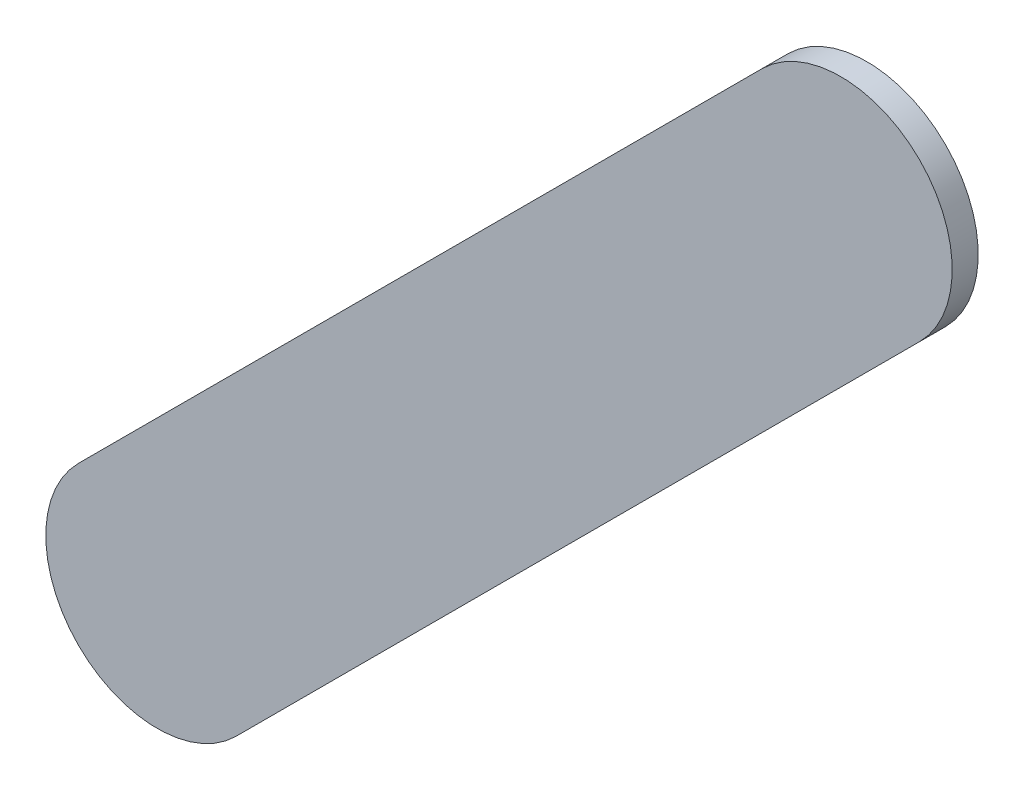
ISO-10303-21;
HEADER;
FILE_DESCRIPTION(('STEP AP214'),'2;1');
FILE_NAME('part.step','',(''),(''),'','','');
FILE_SCHEMA(('AUTOMOTIVE_DESIGN { 1 0 10303 214 1 1 1 1 }'));
ENDSEC;
DATA;
#1=APPLICATION_CONTEXT('core data for automotive mechanical design processes');
#2=APPLICATION_PROTOCOL_DEFINITION('international standard','automotive_design',2000,#1);
#3=PRODUCT_CONTEXT('',#1,'mechanical');
#4=PRODUCT('Part','Part','',(#3));
#5=PRODUCT_RELATED_PRODUCT_CATEGORY('part','',(#4));
#6=PRODUCT_DEFINITION_FORMATION('','',#4);
#7=PRODUCT_DEFINITION_CONTEXT('part definition',#1,'design');
#8=PRODUCT_DEFINITION('design','',#6,#7);
#9=PRODUCT_DEFINITION_SHAPE('','',#8);
#10=(LENGTH_UNIT() NAMED_UNIT(*) SI_UNIT(.MILLI.,.METRE.));
#11=(NAMED_UNIT(*) PLANE_ANGLE_UNIT() SI_UNIT($,.RADIAN.));
#12=(NAMED_UNIT(*) SI_UNIT($,.STERADIAN.) SOLID_ANGLE_UNIT());
#13=UNCERTAINTY_MEASURE_WITH_UNIT(LENGTH_MEASURE(1.E-05),#10,'distance_accuracy_value','');
#14=(GEOMETRIC_REPRESENTATION_CONTEXT(3) GLOBAL_UNCERTAINTY_ASSIGNED_CONTEXT((#13)) GLOBAL_UNIT_ASSIGNED_CONTEXT((#10,
#11,#12)) REPRESENTATION_CONTEXT('',''));
#15=CARTESIAN_POINT('',(0.,0.,0.));
#16=DIRECTION('',(0.,0.,1.));
#17=DIRECTION('',(1.,0.,0.));
#18=AXIS2_PLACEMENT_3D('',#15,#16,#17);
#19=CARTESIAN_POINT('',(126.106067,-60.436065,1.635));
#20=DIRECTION('',(0.,0.,1.));
#21=DIRECTION('',(1.,0.,0.));
#22=AXIS2_PLACEMENT_3D('',#19,#20,#21);
#23=PLANE('',#22);
#24=DIRECTION('',(0.707106781186548,0.707106781186548,0.));
#25=VECTOR('',#24,1.);
#26=CARTESIAN_POINT('',(126.106067,-60.436065,1.635));
#27=LINE('',#26,#25);
#28=CARTESIAN_POINT('',(126.106067,-60.436065,1.635));
#29=VERTEX_POINT('',#28);
#30=CARTESIAN_POINT('',(127.026066,-59.516066,1.635));
#31=VERTEX_POINT('',#30);
#32=EDGE_CURVE('E85',#29,#31,#27,.T.);
#33=ORIENTED_EDGE('',*,*,#32,.T.);
#34=CARTESIAN_POINT('',(126.9199995,-59.4099995,1.635));
#35=DIRECTION('',(0.,0.,1.));
#36=DIRECTION('',(0.707106781186548,-0.707106781186548,0.));
#37=AXIS2_PLACEMENT_3D('',#34,#35,#36);
#38=CIRCLE('',#37,0.150000682813);
#39=CARTESIAN_POINT('',(126.813933,-59.303933,1.635));
#40=VERTEX_POINT('',#39);
#41=EDGE_CURVE('E107',#31,#40,#38,.T.);
#42=ORIENTED_EDGE('',*,*,#41,.T.);
#43=DIRECTION('',(-0.707106781186548,-0.707106781186548,0.));
#44=VECTOR('',#43,1.);
#45=CARTESIAN_POINT('',(126.813933,-59.303933,1.635));
#46=LINE('',#45,#44);
#47=CARTESIAN_POINT('',(125.893934,-60.223932,1.635));
#48=VERTEX_POINT('',#47);
#49=EDGE_CURVE('E62',#40,#48,#46,.T.);
#50=ORIENTED_EDGE('',*,*,#49,.T.);
#51=CARTESIAN_POINT('',(126.0000005,-60.3299985,1.635));
#52=DIRECTION('',(0.,0.,1.));
#53=DIRECTION('',(-0.707106781186548,0.707106781186548,0.));
#54=AXIS2_PLACEMENT_3D('',#51,#52,#53);
#55=CIRCLE('',#54,0.150000682813);
#56=EDGE_CURVE('E11',#48,#29,#55,.T.);
#57=ORIENTED_EDGE('',*,*,#56,.T.);
#58=EDGE_LOOP('',(#33,#42,#50,#57));
#59=FACE_BOUND('',#58,.T.);
#60=ADVANCED_FACE('F17',(#59),#23,.T.);
#61=CARTESIAN_POINT('',(126.106067,-60.436065,1.6));
#62=DIRECTION('',(0.,0.,1.));
#63=DIRECTION('',(1.,0.,0.));
#64=AXIS2_PLACEMENT_3D('',#61,#62,#63);
#65=PLANE('',#64);
#66=CARTESIAN_POINT('',(126.0000005,-60.3299985,1.6));
#67=DIRECTION('',(0.,0.,1.));
#68=DIRECTION('',(-0.707106781186548,0.707106781186548,0.));
#69=AXIS2_PLACEMENT_3D('',#66,#67,#68);
#70=CIRCLE('',#69,0.150000682813);
#71=CARTESIAN_POINT('',(125.893934,-60.223932,1.6));
#72=VERTEX_POINT('',#71);
#73=CARTESIAN_POINT('',(126.106067,-60.436065,1.6));
#74=VERTEX_POINT('',#73);
#75=EDGE_CURVE('E20',#72,#74,#70,.T.);
#76=ORIENTED_EDGE('',*,*,#75,.F.);
#77=DIRECTION('',(-0.707106781186548,-0.707106781186548,0.));
#78=VECTOR('',#77,1.);
#79=CARTESIAN_POINT('',(126.813933,-59.303933,1.6));
#80=LINE('',#79,#78);
#81=CARTESIAN_POINT('',(126.813933,-59.303933,1.6));
#82=VERTEX_POINT('',#81);
#83=EDGE_CURVE('E54',#82,#72,#80,.T.);
#84=ORIENTED_EDGE('',*,*,#83,.F.);
#85=CARTESIAN_POINT('',(126.9199995,-59.4099995,1.6));
#86=DIRECTION('',(0.,0.,1.));
#87=DIRECTION('',(0.707106781186548,-0.707106781186548,0.));
#88=AXIS2_PLACEMENT_3D('',#85,#86,#87);
#89=CIRCLE('',#88,0.150000682813);
#90=CARTESIAN_POINT('',(127.026066,-59.516066,1.6));
#91=VERTEX_POINT('',#90);
#92=EDGE_CURVE('E87',#91,#82,#89,.T.);
#93=ORIENTED_EDGE('',*,*,#92,.F.);
#94=DIRECTION('',(0.707106781186548,0.707106781186548,0.));
#95=VECTOR('',#94,1.);
#96=CARTESIAN_POINT('',(126.106067,-60.436065,1.6));
#97=LINE('',#96,#95);
#98=EDGE_CURVE('E83',#74,#91,#97,.T.);
#99=ORIENTED_EDGE('',*,*,#98,.F.);
#100=EDGE_LOOP('',(#76,#84,#93,#99));
#101=FACE_BOUND('',#100,.T.);
#102=ADVANCED_FACE('F89',(#101),#65,.F.);
#103=CARTESIAN_POINT('',(126.0000005,-60.3299985,1.6));
#104=DIRECTION('',(0.,0.,-1.));
#105=DIRECTION('',(-0.707106781186548,0.707106781186548,0.));
#106=AXIS2_PLACEMENT_3D('',#103,#104,#105);
#107=CYLINDRICAL_SURFACE('',#106,0.150000682813);
#108=ORIENTED_EDGE('',*,*,#75,.T.);
#109=DIRECTION('',(0.,0.,1.));
#110=VECTOR('',#109,1.);
#111=CARTESIAN_POINT('',(126.106067,-60.436065,1.6));
#112=LINE('',#111,#110);
#113=EDGE_CURVE('E74',#74,#29,#112,.T.);
#114=ORIENTED_EDGE('',*,*,#113,.T.);
#115=ORIENTED_EDGE('',*,*,#56,.F.);
#116=DIRECTION('',(0.,0.,1.));
#117=VECTOR('',#116,1.);
#118=CARTESIAN_POINT('',(125.893934,-60.223932,1.6));
#119=LINE('',#118,#117);
#120=EDGE_CURVE('E76',#72,#48,#119,.T.);
#121=ORIENTED_EDGE('',*,*,#120,.F.);
#122=EDGE_LOOP('',(#108,#114,#115,#121));
#123=FACE_BOUND('',#122,.T.);
#124=ADVANCED_FACE('F73',(#123),#107,.T.);
#125=CARTESIAN_POINT('',(126.813933,-59.303933,1.6));
#126=DIRECTION('',(0.707106781186548,-0.707106781186548,0.));
#127=DIRECTION('',(0.,0.,-1.));
#128=AXIS2_PLACEMENT_3D('',#125,#126,#127);
#129=PLANE('',#128);
#130=ORIENTED_EDGE('',*,*,#83,.T.);
#131=ORIENTED_EDGE('',*,*,#120,.T.);
#132=ORIENTED_EDGE('',*,*,#49,.F.);
#133=DIRECTION('',(0.,0.,1.));
#134=VECTOR('',#133,1.);
#135=CARTESIAN_POINT('',(126.813933,-59.303933,1.6));
#136=LINE('',#135,#134);
#137=EDGE_CURVE('E106',#82,#40,#136,.T.);
#138=ORIENTED_EDGE('',*,*,#137,.F.);
#139=EDGE_LOOP('',(#130,#131,#132,#138));
#140=FACE_BOUND('',#139,.T.);
#141=ADVANCED_FACE('F116',(#140),#129,.F.);
#142=CARTESIAN_POINT('',(126.9199995,-59.4099995,1.6));
#143=DIRECTION('',(0.,0.,-1.));
#144=DIRECTION('',(0.707106781186548,-0.707106781186548,0.));
#145=AXIS2_PLACEMENT_3D('',#142,#143,#144);
#146=CYLINDRICAL_SURFACE('',#145,0.150000682813);
#147=ORIENTED_EDGE('',*,*,#92,.T.);
#148=ORIENTED_EDGE('',*,*,#137,.T.);
#149=ORIENTED_EDGE('',*,*,#41,.F.);
#150=DIRECTION('',(0.,0.,1.));
#151=VECTOR('',#150,1.);
#152=CARTESIAN_POINT('',(127.026066,-59.516066,1.6));
#153=LINE('',#152,#151);
#154=EDGE_CURVE('E93',#91,#31,#153,.T.);
#155=ORIENTED_EDGE('',*,*,#154,.F.);
#156=EDGE_LOOP('',(#147,#148,#149,#155));
#157=FACE_BOUND('',#156,.T.);
#158=ADVANCED_FACE('F121',(#157),#146,.T.);
#159=CARTESIAN_POINT('',(126.106067,-60.436065,1.6));
#160=DIRECTION('',(-0.707106781186548,0.707106781186548,0.));
#161=DIRECTION('',(0.,0.,1.));
#162=AXIS2_PLACEMENT_3D('',#159,#160,#161);
#163=PLANE('',#162);
#164=ORIENTED_EDGE('',*,*,#98,.T.);
#165=ORIENTED_EDGE('',*,*,#154,.T.);
#166=ORIENTED_EDGE('',*,*,#32,.F.);
#167=ORIENTED_EDGE('',*,*,#113,.F.);
#168=EDGE_LOOP('',(#164,#165,#166,#167));
#169=FACE_BOUND('',#168,.T.);
#170=ADVANCED_FACE('F81',(#169),#163,.F.);
#171=CLOSED_SHELL('',(#60,#102,#124,#141,#158,#170));
#172=MANIFOLD_SOLID_BREP('B1',#171);
#173=ADVANCED_BREP_SHAPE_REPRESENTATION('',(#18,#172),#14);
#174=SHAPE_DEFINITION_REPRESENTATION(#9,#173);
ENDSEC;
END-ISO-10303-21;
